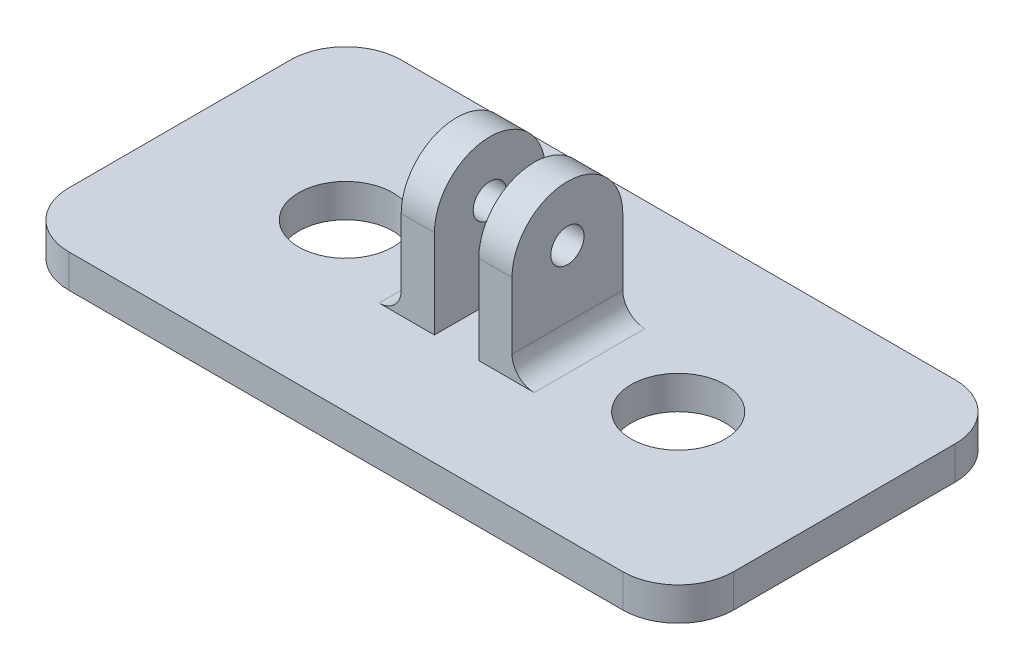
ISO-10303-21;
HEADER;
FILE_DESCRIPTION(('STEP AP214'),'2;1');
FILE_NAME('part.step','',(''),(''),'','','');
FILE_SCHEMA(('AUTOMOTIVE_DESIGN { 1 0 10303 214 1 1 1 1 }'));
ENDSEC;
DATA;
#1=APPLICATION_CONTEXT('core data for automotive mechanical design processes');
#2=APPLICATION_PROTOCOL_DEFINITION('international standard','automotive_design',2000,#1);
#3=PRODUCT_CONTEXT('',#1,'mechanical');
#4=PRODUCT('Part','Part','',(#3));
#5=PRODUCT_RELATED_PRODUCT_CATEGORY('part','',(#4));
#6=PRODUCT_DEFINITION_FORMATION('','',#4);
#7=PRODUCT_DEFINITION_CONTEXT('part definition',#1,'design');
#8=PRODUCT_DEFINITION('design','',#6,#7);
#9=PRODUCT_DEFINITION_SHAPE('','',#8);
#10=(LENGTH_UNIT() NAMED_UNIT(*) SI_UNIT(.MILLI.,.METRE.));
#11=(NAMED_UNIT(*) PLANE_ANGLE_UNIT() SI_UNIT($,.RADIAN.));
#12=(NAMED_UNIT(*) SI_UNIT($,.STERADIAN.) SOLID_ANGLE_UNIT());
#13=UNCERTAINTY_MEASURE_WITH_UNIT(LENGTH_MEASURE(1.E-05),#10,'distance_accuracy_value','');
#14=(GEOMETRIC_REPRESENTATION_CONTEXT(3) GLOBAL_UNCERTAINTY_ASSIGNED_CONTEXT((#13)) GLOBAL_UNIT_ASSIGNED_CONTEXT((#10,
#11,#12)) REPRESENTATION_CONTEXT('',''));
#15=CARTESIAN_POINT('',(0.,0.,0.));
#16=DIRECTION('',(0.,0.,1.));
#17=DIRECTION('',(1.,0.,0.));
#18=AXIS2_PLACEMENT_3D('',#15,#16,#17);
#19=CARTESIAN_POINT('',(-5.,16.,-5.));
#20=DIRECTION('',(1.,0.,0.));
#21=DIRECTION('',(0.,0.,-1.));
#22=AXIS2_PLACEMENT_3D('',#19,#20,#21);
#23=PLANE('',#22);
#24=CARTESIAN_POINT('',(-5.,11.,0.));
#25=DIRECTION('',(-1.,0.,0.));
#26=DIRECTION('',(0.,0.,1.));
#27=AXIS2_PLACEMENT_3D('',#24,#25,#26);
#28=CIRCLE('',#27,1.5);
#29=CARTESIAN_POINT('',(-5.,11.,1.5));
#30=VERTEX_POINT('',#29);
#31=EDGE_CURVE('E216',#30,#30,#28,.T.);
#32=ORIENTED_EDGE('',*,*,#31,.F.);
#33=EDGE_LOOP('',(#32));
#34=FACE_BOUND('',#33,.T.);
#35=DIRECTION('',(0.,0.,1.));
#36=VECTOR('',#35,1.);
#37=CARTESIAN_POINT('',(-5.,5.,-5.));
#38=LINE('',#37,#36);
#39=CARTESIAN_POINT('',(-5.,5.,-5.));
#40=VERTEX_POINT('',#39);
#41=CARTESIAN_POINT('',(-5.,5.,5.));
#42=VERTEX_POINT('',#41);
#43=EDGE_CURVE('E56',#40,#42,#38,.T.);
#44=ORIENTED_EDGE('',*,*,#43,.T.);
#45=DIRECTION('',(0.,-1.,0.));
#46=VECTOR('',#45,1.);
#47=CARTESIAN_POINT('',(-5.,16.,5.));
#48=LINE('',#47,#46);
#49=CARTESIAN_POINT('',(-5.,11.,5.));
#50=VERTEX_POINT('',#49);
#51=EDGE_CURVE('E280',#50,#42,#48,.T.);
#52=ORIENTED_EDGE('',*,*,#51,.F.);
#53=CARTESIAN_POINT('',(-5.,11.,0.));
#54=DIRECTION('',(1.,0.,0.));
#55=DIRECTION('',(0.,0.,-1.));
#56=AXIS2_PLACEMENT_3D('',#53,#54,#55);
#57=CIRCLE('',#56,5.);
#58=CARTESIAN_POINT('',(-5.,11.,-5.));
#59=VERTEX_POINT('',#58);
#60=EDGE_CURVE('E245',#59,#50,#57,.T.);
#61=ORIENTED_EDGE('',*,*,#60,.F.);
#62=DIRECTION('',(0.,-1.,0.));
#63=VECTOR('',#62,1.);
#64=CARTESIAN_POINT('',(-5.,16.,-5.));
#65=LINE('',#64,#63);
#66=EDGE_CURVE('E283',#59,#40,#65,.T.);
#67=ORIENTED_EDGE('',*,*,#66,.T.);
#68=EDGE_LOOP('',(#44,#52,#61,#67));
#69=FACE_BOUND('',#68,.T.);
#70=ADVANCED_FACE('F39',(#34,#69),#23,.F.);
#71=CARTESIAN_POINT('',(-2.,16.,-5.));
#72=DIRECTION('',(-1.,0.,0.));
#73=DIRECTION('',(0.,0.,1.));
#74=AXIS2_PLACEMENT_3D('',#71,#72,#73);
#75=PLANE('',#74);
#76=CARTESIAN_POINT('',(-2.,11.,0.));
#77=DIRECTION('',(-1.,0.,0.));
#78=DIRECTION('',(0.,0.,1.));
#79=AXIS2_PLACEMENT_3D('',#76,#77,#78);
#80=CIRCLE('',#79,1.5);
#81=CARTESIAN_POINT('',(-2.,11.,1.5));
#82=VERTEX_POINT('',#81);
#83=EDGE_CURVE('E226',#82,#82,#80,.T.);
#84=ORIENTED_EDGE('',*,*,#83,.T.);
#85=EDGE_LOOP('',(#84));
#86=FACE_BOUND('',#85,.T.);
#87=DIRECTION('',(0.,-1.,0.));
#88=VECTOR('',#87,1.);
#89=CARTESIAN_POINT('',(-2.,16.,-5.));
#90=LINE('',#89,#88);
#91=CARTESIAN_POINT('',(-2.,11.,-5.));
#92=VERTEX_POINT('',#91);
#93=CARTESIAN_POINT('',(-2.,3.,-5.));
#94=VERTEX_POINT('',#93);
#95=EDGE_CURVE('E286',#92,#94,#90,.T.);
#96=ORIENTED_EDGE('',*,*,#95,.F.);
#97=CARTESIAN_POINT('',(-2.,11.,0.));
#98=DIRECTION('',(-1.,0.,0.));
#99=DIRECTION('',(0.,0.,1.));
#100=AXIS2_PLACEMENT_3D('',#97,#98,#99);
#101=CIRCLE('',#100,5.);
#102=CARTESIAN_POINT('',(-2.,11.,5.));
#103=VERTEX_POINT('',#102);
#104=EDGE_CURVE('E181',#103,#92,#101,.T.);
#105=ORIENTED_EDGE('',*,*,#104,.F.);
#106=DIRECTION('',(0.,-1.,0.));
#107=VECTOR('',#106,1.);
#108=CARTESIAN_POINT('',(-2.,16.,5.));
#109=LINE('',#108,#107);
#110=CARTESIAN_POINT('',(-2.,3.,5.));
#111=VERTEX_POINT('',#110);
#112=EDGE_CURVE('E277',#103,#111,#109,.T.);
#113=ORIENTED_EDGE('',*,*,#112,.T.);
#114=DIRECTION('',(0.,0.,-1.));
#115=VECTOR('',#114,1.);
#116=CARTESIAN_POINT('',(-2.,3.,-5.));
#117=LINE('',#116,#115);
#118=EDGE_CURVE('E267',#111,#94,#117,.T.);
#119=ORIENTED_EDGE('',*,*,#118,.T.);
#120=EDGE_LOOP('',(#96,#105,#113,#119));
#121=FACE_BOUND('',#120,.T.);
#122=ADVANCED_FACE('F433',(#86,#121),#75,.F.);
#123=CARTESIAN_POINT('',(5.,16.,-5.));
#124=DIRECTION('',(-1.,0.,0.));
#125=DIRECTION('',(0.,0.,1.));
#126=AXIS2_PLACEMENT_3D('',#123,#124,#125);
#127=PLANE('',#126);
#128=CARTESIAN_POINT('',(5.,11.,0.));
#129=DIRECTION('',(-1.,0.,0.));
#130=DIRECTION('',(0.,0.,1.));
#131=AXIS2_PLACEMENT_3D('',#128,#129,#130);
#132=CIRCLE('',#131,1.5);
#133=CARTESIAN_POINT('',(5.,11.,1.5));
#134=VERTEX_POINT('',#133);
#135=EDGE_CURVE('E222',#134,#134,#132,.T.);
#136=ORIENTED_EDGE('',*,*,#135,.T.);
#137=EDGE_LOOP('',(#136));
#138=FACE_BOUND('',#137,.T.);
#139=DIRECTION('',(0.,-1.,0.));
#140=VECTOR('',#139,1.);
#141=CARTESIAN_POINT('',(5.,16.,5.));
#142=LINE('',#141,#140);
#143=CARTESIAN_POINT('',(5.,11.,5.));
#144=VERTEX_POINT('',#143);
#145=CARTESIAN_POINT('',(5.,5.,5.));
#146=VERTEX_POINT('',#145);
#147=EDGE_CURVE('E255',#144,#146,#142,.T.);
#148=ORIENTED_EDGE('',*,*,#147,.T.);
#149=DIRECTION('',(0.,0.,1.));
#150=VECTOR('',#149,1.);
#151=CARTESIAN_POINT('',(5.,5.,-5.));
#152=LINE('',#151,#150);
#153=CARTESIAN_POINT('',(5.,5.,-5.));
#154=VERTEX_POINT('',#153);
#155=EDGE_CURVE('E191',#154,#146,#152,.T.);
#156=ORIENTED_EDGE('',*,*,#155,.F.);
#157=DIRECTION('',(0.,-1.,0.));
#158=VECTOR('',#157,1.);
#159=CARTESIAN_POINT('',(5.,16.,-5.));
#160=LINE('',#159,#158);
#161=CARTESIAN_POINT('',(5.,11.,-5.));
#162=VERTEX_POINT('',#161);
#163=EDGE_CURVE('E196',#162,#154,#160,.T.);
#164=ORIENTED_EDGE('',*,*,#163,.F.);
#165=CARTESIAN_POINT('',(5.,11.,0.));
#166=DIRECTION('',(1.,0.,0.));
#167=DIRECTION('',(0.,0.,-1.));
#168=AXIS2_PLACEMENT_3D('',#165,#166,#167);
#169=CIRCLE('',#168,5.);
#170=EDGE_CURVE('E234',#162,#144,#169,.T.);
#171=ORIENTED_EDGE('',*,*,#170,.T.);
#172=EDGE_LOOP('',(#148,#156,#164,#171));
#173=FACE_BOUND('',#172,.T.);
#174=ADVANCED_FACE('F439',(#138,#173),#127,.F.);
#175=CARTESIAN_POINT('',(2.,16.,-5.));
#176=DIRECTION('',(1.,0.,0.));
#177=DIRECTION('',(0.,0.,-1.));
#178=AXIS2_PLACEMENT_3D('',#175,#176,#177);
#179=PLANE('',#178);
#180=CARTESIAN_POINT('',(2.,11.,0.));
#181=DIRECTION('',(1.,0.,0.));
#182=DIRECTION('',(0.,0.,-1.));
#183=AXIS2_PLACEMENT_3D('',#180,#181,#182);
#184=CIRCLE('',#183,1.5);
#185=CARTESIAN_POINT('',(2.,11.,1.5));
#186=VERTEX_POINT('',#185);
#187=EDGE_CURVE('E43',#186,#186,#184,.T.);
#188=ORIENTED_EDGE('',*,*,#187,.T.);
#189=EDGE_LOOP('',(#188));
#190=FACE_BOUND('',#189,.T.);
#191=CARTESIAN_POINT('',(2.,11.,0.));
#192=DIRECTION('',(1.,0.,0.));
#193=DIRECTION('',(0.,0.,-1.));
#194=AXIS2_PLACEMENT_3D('',#191,#192,#193);
#195=CIRCLE('',#194,5.);
#196=CARTESIAN_POINT('',(1.99999999999999,11.,-5.));
#197=VERTEX_POINT('',#196);
#198=CARTESIAN_POINT('',(1.99999999999999,11.,5.));
#199=VERTEX_POINT('',#198);
#200=EDGE_CURVE('E242',#197,#199,#195,.T.);
#201=ORIENTED_EDGE('',*,*,#200,.F.);
#202=DIRECTION('',(0.,-1.,0.));
#203=VECTOR('',#202,1.);
#204=CARTESIAN_POINT('',(2.,16.,-5.));
#205=LINE('',#204,#203);
#206=CARTESIAN_POINT('',(2.,3.,-5.));
#207=VERTEX_POINT('',#206);
#208=EDGE_CURVE('E262',#197,#207,#205,.T.);
#209=ORIENTED_EDGE('',*,*,#208,.T.);
#210=DIRECTION('',(0.,0.,1.));
#211=VECTOR('',#210,1.);
#212=CARTESIAN_POINT('',(2.,3.,-5.));
#213=LINE('',#212,#211);
#214=CARTESIAN_POINT('',(2.,3.,5.));
#215=VERTEX_POINT('',#214);
#216=EDGE_CURVE('E176',#207,#215,#213,.T.);
#217=ORIENTED_EDGE('',*,*,#216,.T.);
#218=DIRECTION('',(0.,-1.,0.));
#219=VECTOR('',#218,1.);
#220=CARTESIAN_POINT('',(2.,16.,5.));
#221=LINE('',#220,#219);
#222=EDGE_CURVE('E259',#199,#215,#221,.T.);
#223=ORIENTED_EDGE('',*,*,#222,.F.);
#224=EDGE_LOOP('',(#201,#209,#217,#223));
#225=FACE_BOUND('',#224,.T.);
#226=ADVANCED_FACE('F523',(#190,#225),#179,.F.);
#227=CARTESIAN_POINT('',(-5.,16.,5.));
#228=DIRECTION('',(0.,0.,-1.));
#229=DIRECTION('',(-1.,0.,0.));
#230=AXIS2_PLACEMENT_3D('',#227,#228,#229);
#231=PLANE('',#230);
#232=DIRECTION('',(1.,0.,0.));
#233=VECTOR('',#232,1.);
#234=CARTESIAN_POINT('',(-8.,11.,5.));
#235=LINE('',#234,#233);
#236=EDGE_CURVE('E241',#50,#103,#235,.T.);
#237=ORIENTED_EDGE('',*,*,#236,.F.);
#238=ORIENTED_EDGE('',*,*,#51,.T.);
#239=CARTESIAN_POINT('',(-7.,5.,5.));
#240=DIRECTION('',(0.,0.,-1.));
#241=DIRECTION('',(-1.,0.,0.));
#242=AXIS2_PLACEMENT_3D('',#239,#240,#241);
#243=CIRCLE('',#242,2.);
#244=CARTESIAN_POINT('',(-7.,3.,5.));
#245=VERTEX_POINT('',#244);
#246=EDGE_CURVE('E203',#42,#245,#243,.T.);
#247=ORIENTED_EDGE('',*,*,#246,.T.);
#248=DIRECTION('',(1.,0.,0.));
#249=VECTOR('',#248,1.);
#250=CARTESIAN_POINT('',(-5.,3.,5.));
#251=LINE('',#250,#249);
#252=EDGE_CURVE('E273',#245,#111,#251,.T.);
#253=ORIENTED_EDGE('',*,*,#252,.T.);
#254=ORIENTED_EDGE('',*,*,#112,.F.);
#255=EDGE_LOOP('',(#237,#238,#247,#253,#254));
#256=FACE_BOUND('',#255,.T.);
#257=ADVANCED_FACE('F444',(#256),#231,.F.);
#258=CARTESIAN_POINT('',(2.,16.,5.));
#259=DIRECTION('',(0.,0.,-1.));
#260=DIRECTION('',(-1.,0.,0.));
#261=AXIS2_PLACEMENT_3D('',#258,#259,#260);
#262=PLANE('',#261);
#263=EDGE_CURVE('E238',#199,#144,#235,.T.);
#264=ORIENTED_EDGE('',*,*,#263,.F.);
#265=ORIENTED_EDGE('',*,*,#222,.T.);
#266=DIRECTION('',(1.,0.,0.));
#267=VECTOR('',#266,1.);
#268=CARTESIAN_POINT('',(2.,3.,5.));
#269=LINE('',#268,#267);
#270=CARTESIAN_POINT('',(7.,3.,5.));
#271=VERTEX_POINT('',#270);
#272=EDGE_CURVE('E252',#215,#271,#269,.T.);
#273=ORIENTED_EDGE('',*,*,#272,.T.);
#274=CARTESIAN_POINT('',(7.,5.,5.));
#275=DIRECTION('',(0.,0.,-1.));
#276=DIRECTION('',(-1.,0.,0.));
#277=AXIS2_PLACEMENT_3D('',#274,#275,#276);
#278=CIRCLE('',#277,2.);
#279=EDGE_CURVE('E189',#271,#146,#278,.T.);
#280=ORIENTED_EDGE('',*,*,#279,.T.);
#281=ORIENTED_EDGE('',*,*,#147,.F.);
#282=EDGE_LOOP('',(#264,#265,#273,#280,#281));
#283=FACE_BOUND('',#282,.T.);
#284=ADVANCED_FACE('F457',(#283),#262,.F.);
#285=CARTESIAN_POINT('',(0.,3.,0.));
#286=DIRECTION('',(0.,1.,0.));
#287=DIRECTION('',(0.,0.,1.));
#288=AXIS2_PLACEMENT_3D('',#285,#286,#287);
#289=PLANE('',#288);
#290=DIRECTION('',(-1.,0.,0.));
#291=VECTOR('',#290,1.);
#292=CARTESIAN_POINT('',(2.,3.,-5.));
#293=LINE('',#292,#291);
#294=CARTESIAN_POINT('',(7.,3.,-5.));
#295=VERTEX_POINT('',#294);
#296=EDGE_CURVE('E169',#295,#207,#293,.T.);
#297=ORIENTED_EDGE('',*,*,#296,.F.);
#298=DIRECTION('',(0.,0.,1.));
#299=VECTOR('',#298,1.);
#300=CARTESIAN_POINT('',(7.,3.,-5.));
#301=LINE('',#300,#299);
#302=EDGE_CURVE('E174',#295,#271,#301,.T.);
#303=ORIENTED_EDGE('',*,*,#302,.T.);
#304=ORIENTED_EDGE('',*,*,#272,.F.);
#305=ORIENTED_EDGE('',*,*,#216,.F.);
#306=EDGE_LOOP('',(#297,#303,#304,#305));
#307=FACE_BOUND('',#306,.T.);
#308=DIRECTION('',(0.,0.,1.));
#309=VECTOR('',#308,1.);
#310=CARTESIAN_POINT('',(-7.00000000000001,3.,-5.));
#311=LINE('',#310,#309);
#312=CARTESIAN_POINT('',(-7.,3.,-5.));
#313=VERTEX_POINT('',#312);
#314=EDGE_CURVE('E212',#313,#245,#311,.T.);
#315=ORIENTED_EDGE('',*,*,#314,.F.);
#316=DIRECTION('',(-1.,0.,0.));
#317=VECTOR('',#316,1.);
#318=CARTESIAN_POINT('',(-5.,3.,-5.));
#319=LINE('',#318,#317);
#320=EDGE_CURVE('E64',#94,#313,#319,.T.);
#321=ORIENTED_EDGE('',*,*,#320,.F.);
#322=ORIENTED_EDGE('',*,*,#118,.F.);
#323=ORIENTED_EDGE('',*,*,#252,.F.);
#324=EDGE_LOOP('',(#315,#321,#322,#323));
#325=FACE_BOUND('',#324,.T.);
#326=CARTESIAN_POINT('',(-15.,3.,0.));
#327=DIRECTION('',(0.,1.,0.));
#328=DIRECTION('',(0.,0.,1.));
#329=AXIS2_PLACEMENT_3D('',#326,#327,#328);
#330=CIRCLE('',#329,4.25);
#331=CARTESIAN_POINT('',(-15.,3.,4.25));
#332=VERTEX_POINT('',#331);
#333=EDGE_CURVE('E295',#332,#332,#330,.T.);
#334=ORIENTED_EDGE('',*,*,#333,.F.);
#335=EDGE_LOOP('',(#334));
#336=FACE_BOUND('',#335,.T.);
#337=CARTESIAN_POINT('',(15.,3.,0.));
#338=DIRECTION('',(0.,1.,0.));
#339=DIRECTION('',(0.,0.,1.));
#340=AXIS2_PLACEMENT_3D('',#337,#338,#339);
#341=CIRCLE('',#340,4.25);
#342=CARTESIAN_POINT('',(15.,3.,4.25));
#343=VERTEX_POINT('',#342);
#344=EDGE_CURVE('E289',#343,#343,#341,.T.);
#345=ORIENTED_EDGE('',*,*,#344,.F.);
#346=EDGE_LOOP('',(#345));
#347=FACE_BOUND('',#346,.T.);
#348=DIRECTION('',(-1.,0.,0.));
#349=VECTOR('',#348,1.);
#350=CARTESIAN_POINT('',(-30.,3.,-15.));
#351=LINE('',#350,#349);
#352=CARTESIAN_POINT('',(25.,3.,-15.));
#353=VERTEX_POINT('',#352);
#354=CARTESIAN_POINT('',(-25.,3.,-15.));
#355=VERTEX_POINT('',#354);
#356=EDGE_CURVE('E310',#353,#355,#351,.T.);
#357=ORIENTED_EDGE('',*,*,#356,.T.);
#358=CARTESIAN_POINT('',(-25.,3.,-10.));
#359=DIRECTION('',(0.,1.,0.));
#360=DIRECTION('',(0.,0.,1.));
#361=AXIS2_PLACEMENT_3D('',#358,#359,#360);
#362=CIRCLE('',#361,5.);
#363=CARTESIAN_POINT('',(-30.,3.,-10.));
#364=VERTEX_POINT('',#363);
#365=EDGE_CURVE('E372',#355,#364,#362,.T.);
#366=ORIENTED_EDGE('',*,*,#365,.T.);
#367=DIRECTION('',(0.,0.,1.));
#368=VECTOR('',#367,1.);
#369=CARTESIAN_POINT('',(-30.,3.,-15.));
#370=LINE('',#369,#368);
#371=CARTESIAN_POINT('',(-30.,3.,10.));
#372=VERTEX_POINT('',#371);
#373=EDGE_CURVE('E315',#364,#372,#370,.T.);
#374=ORIENTED_EDGE('',*,*,#373,.T.);
#375=CARTESIAN_POINT('',(-25.,3.,10.));
#376=DIRECTION('',(0.,1.,0.));
#377=DIRECTION('',(0.,0.,1.));
#378=AXIS2_PLACEMENT_3D('',#375,#376,#377);
#379=CIRCLE('',#378,5.);
#380=CARTESIAN_POINT('',(-25.,3.,15.));
#381=VERTEX_POINT('',#380);
#382=EDGE_CURVE('E363',#372,#381,#379,.T.);
#383=ORIENTED_EDGE('',*,*,#382,.T.);
#384=DIRECTION('',(1.,0.,0.));
#385=VECTOR('',#384,1.);
#386=CARTESIAN_POINT('',(-30.,3.,15.));
#387=LINE('',#386,#385);
#388=CARTESIAN_POINT('',(25.,3.,15.));
#389=VERTEX_POINT('',#388);
#390=EDGE_CURVE('E319',#381,#389,#387,.T.);
#391=ORIENTED_EDGE('',*,*,#390,.T.);
#392=CARTESIAN_POINT('',(25.,3.,10.));
#393=DIRECTION('',(0.,1.,0.));
#394=DIRECTION('',(0.,0.,1.));
#395=AXIS2_PLACEMENT_3D('',#392,#393,#394);
#396=CIRCLE('',#395,5.);
#397=CARTESIAN_POINT('',(30.,3.,10.));
#398=VERTEX_POINT('',#397);
#399=EDGE_CURVE('E366',#389,#398,#396,.T.);
#400=ORIENTED_EDGE('',*,*,#399,.T.);
#401=DIRECTION('',(0.,0.,-1.));
#402=VECTOR('',#401,1.);
#403=CARTESIAN_POINT('',(30.,3.,-15.));
#404=LINE('',#403,#402);
#405=CARTESIAN_POINT('',(30.,3.,-10.));
#406=VERTEX_POINT('',#405);
#407=EDGE_CURVE('E306',#398,#406,#404,.T.);
#408=ORIENTED_EDGE('',*,*,#407,.T.);
#409=CARTESIAN_POINT('',(25.,3.,-10.));
#410=DIRECTION('',(0.,1.,0.));
#411=DIRECTION('',(0.,0.,1.));
#412=AXIS2_PLACEMENT_3D('',#409,#410,#411);
#413=CIRCLE('',#412,5.);
#414=EDGE_CURVE('E369',#406,#353,#413,.T.);
#415=ORIENTED_EDGE('',*,*,#414,.T.);
#416=EDGE_LOOP('',(#357,#366,#374,#383,#391,#400,#408,#415));
#417=FACE_BOUND('',#416,.T.);
#418=ADVANCED_FACE('F171',(#307,#325,#336,#347,#417),#289,.T.);
#419=CARTESIAN_POINT('',(30.,3.,-15.));
#420=DIRECTION('',(-1.,0.,0.));
#421=DIRECTION('',(0.,0.,1.));
#422=AXIS2_PLACEMENT_3D('',#419,#420,#421);
#423=PLANE('',#422);
#424=DIRECTION('',(0.,0.,-1.));
#425=VECTOR('',#424,1.);
#426=CARTESIAN_POINT('',(30.,0.,-15.));
#427=LINE('',#426,#425);
#428=CARTESIAN_POINT('',(30.,0.,10.));
#429=VERTEX_POINT('',#428);
#430=CARTESIAN_POINT('',(30.,0.,-10.));
#431=VERTEX_POINT('',#430);
#432=EDGE_CURVE('E294',#429,#431,#427,.T.);
#433=ORIENTED_EDGE('',*,*,#432,.T.);
#434=DIRECTION('',(0.,-1.,0.));
#435=VECTOR('',#434,1.);
#436=CARTESIAN_POINT('',(30.,3.,-10.));
#437=LINE('',#436,#435);
#438=EDGE_CURVE('E379',#431,#406,#437,.F.);
#439=ORIENTED_EDGE('',*,*,#438,.T.);
#440=ORIENTED_EDGE('',*,*,#407,.F.);
#441=DIRECTION('',(0.,-1.,0.));
#442=VECTOR('',#441,1.);
#443=CARTESIAN_POINT('',(30.,3.,10.));
#444=LINE('',#443,#442);
#445=EDGE_CURVE('E375',#398,#429,#444,.T.);
#446=ORIENTED_EDGE('',*,*,#445,.T.);
#447=EDGE_LOOP('',(#433,#439,#440,#446));
#448=FACE_BOUND('',#447,.T.);
#449=ADVANCED_FACE('F402',(#448),#423,.F.);
#450=CARTESIAN_POINT('',(-30.,3.,-15.));
#451=DIRECTION('',(0.,0.,1.));
#452=DIRECTION('',(1.,0.,0.));
#453=AXIS2_PLACEMENT_3D('',#450,#451,#452);
#454=PLANE('',#453);
#455=DIRECTION('',(-1.,0.,0.));
#456=VECTOR('',#455,1.);
#457=CARTESIAN_POINT('',(-30.,0.,-15.));
#458=LINE('',#457,#456);
#459=CARTESIAN_POINT('',(25.,0.,-15.));
#460=VERTEX_POINT('',#459);
#461=CARTESIAN_POINT('',(-25.,0.,-15.));
#462=VERTEX_POINT('',#461);
#463=EDGE_CURVE('E327',#460,#462,#458,.T.);
#464=ORIENTED_EDGE('',*,*,#463,.T.);
#465=DIRECTION('',(0.,-1.,0.));
#466=VECTOR('',#465,1.);
#467=CARTESIAN_POINT('',(-25.,3.,-15.));
#468=LINE('',#467,#466);
#469=EDGE_CURVE('E360',#462,#355,#468,.F.);
#470=ORIENTED_EDGE('',*,*,#469,.T.);
#471=ORIENTED_EDGE('',*,*,#356,.F.);
#472=DIRECTION('',(0.,-1.,0.));
#473=VECTOR('',#472,1.);
#474=CARTESIAN_POINT('',(25.,3.,-15.));
#475=LINE('',#474,#473);
#476=EDGE_CURVE('E356',#353,#460,#475,.T.);
#477=ORIENTED_EDGE('',*,*,#476,.T.);
#478=EDGE_LOOP('',(#464,#470,#471,#477));
#479=FACE_BOUND('',#478,.T.);
#480=ADVANCED_FACE('F414',(#479),#454,.F.);
#481=CARTESIAN_POINT('',(-30.,3.,-15.));
#482=DIRECTION('',(1.,0.,0.));
#483=DIRECTION('',(0.,0.,-1.));
#484=AXIS2_PLACEMENT_3D('',#481,#482,#483);
#485=PLANE('',#484);
#486=ORIENTED_EDGE('',*,*,#373,.F.);
#487=DIRECTION('',(0.,-1.,0.));
#488=VECTOR('',#487,1.);
#489=CARTESIAN_POINT('',(-30.,3.,-10.));
#490=LINE('',#489,#488);
#491=CARTESIAN_POINT('',(-30.,0.,-10.));
#492=VERTEX_POINT('',#491);
#493=EDGE_CURVE('E340',#364,#492,#490,.T.);
#494=ORIENTED_EDGE('',*,*,#493,.T.);
#495=DIRECTION('',(0.,0.,1.));
#496=VECTOR('',#495,1.);
#497=CARTESIAN_POINT('',(-30.,0.,-15.));
#498=LINE('',#497,#496);
#499=CARTESIAN_POINT('',(-30.,0.,10.));
#500=VERTEX_POINT('',#499);
#501=EDGE_CURVE('E331',#492,#500,#498,.T.);
#502=ORIENTED_EDGE('',*,*,#501,.T.);
#503=DIRECTION('',(0.,-1.,0.));
#504=VECTOR('',#503,1.);
#505=CARTESIAN_POINT('',(-30.,3.,10.));
#506=LINE('',#505,#504);
#507=EDGE_CURVE('E323',#500,#372,#506,.F.);
#508=ORIENTED_EDGE('',*,*,#507,.T.);
#509=EDGE_LOOP('',(#486,#494,#502,#508));
#510=FACE_BOUND('',#509,.T.);
#511=ADVANCED_FACE('F422',(#510),#485,.F.);
#512=CARTESIAN_POINT('',(-30.,3.,15.));
#513=DIRECTION('',(0.,0.,-1.));
#514=DIRECTION('',(-1.,0.,0.));
#515=AXIS2_PLACEMENT_3D('',#512,#513,#514);
#516=PLANE('',#515);
#517=DIRECTION('',(1.,0.,0.));
#518=VECTOR('',#517,1.);
#519=CARTESIAN_POINT('',(-30.,0.,15.));
#520=LINE('',#519,#518);
#521=CARTESIAN_POINT('',(-25.,0.,15.));
#522=VERTEX_POINT('',#521);
#523=CARTESIAN_POINT('',(25.,0.,15.));
#524=VERTEX_POINT('',#523);
#525=EDGE_CURVE('E311',#522,#524,#520,.T.);
#526=ORIENTED_EDGE('',*,*,#525,.T.);
#527=DIRECTION('',(0.,-1.,0.));
#528=VECTOR('',#527,1.);
#529=CARTESIAN_POINT('',(25.,3.,15.));
#530=LINE('',#529,#528);
#531=EDGE_CURVE('E49',#524,#389,#530,.F.);
#532=ORIENTED_EDGE('',*,*,#531,.T.);
#533=ORIENTED_EDGE('',*,*,#390,.F.);
#534=DIRECTION('',(0.,-1.,0.));
#535=VECTOR('',#534,1.);
#536=CARTESIAN_POINT('',(-25.,3.,15.));
#537=LINE('',#536,#535);
#538=EDGE_CURVE('E382',#381,#522,#537,.T.);
#539=ORIENTED_EDGE('',*,*,#538,.T.);
#540=EDGE_LOOP('',(#526,#532,#533,#539));
#541=FACE_BOUND('',#540,.T.);
#542=ADVANCED_FACE('F390',(#541),#516,.F.);
#543=CARTESIAN_POINT('',(0.,0.,0.));
#544=DIRECTION('',(0.,1.,0.));
#545=DIRECTION('',(0.,0.,1.));
#546=AXIS2_PLACEMENT_3D('',#543,#544,#545);
#547=PLANE('',#546);
#548=CARTESIAN_POINT('',(-15.,0.,0.));
#549=DIRECTION('',(0.,1.,0.));
#550=DIRECTION('',(0.,0.,1.));
#551=AXIS2_PLACEMENT_3D('',#548,#549,#550);
#552=CIRCLE('',#551,4.25);
#553=CARTESIAN_POINT('',(-15.,0.,4.25));
#554=VERTEX_POINT('',#553);
#555=EDGE_CURVE('E290',#554,#554,#552,.T.);
#556=ORIENTED_EDGE('',*,*,#555,.T.);
#557=EDGE_LOOP('',(#556));
#558=FACE_BOUND('',#557,.T.);
#559=CARTESIAN_POINT('',(15.,0.,0.));
#560=DIRECTION('',(0.,1.,0.));
#561=DIRECTION('',(0.,0.,1.));
#562=AXIS2_PLACEMENT_3D('',#559,#560,#561);
#563=CIRCLE('',#562,4.25);
#564=CARTESIAN_POINT('',(15.,0.,4.25));
#565=VERTEX_POINT('',#564);
#566=EDGE_CURVE('E299',#565,#565,#563,.T.);
#567=ORIENTED_EDGE('',*,*,#566,.T.);
#568=EDGE_LOOP('',(#567));
#569=FACE_BOUND('',#568,.T.);
#570=ORIENTED_EDGE('',*,*,#501,.F.);
#571=CARTESIAN_POINT('',(-25.,0.,-10.));
#572=DIRECTION('',(0.,1.,0.));
#573=DIRECTION('',(0.,0.,1.));
#574=AXIS2_PLACEMENT_3D('',#571,#572,#573);
#575=CIRCLE('',#574,5.);
#576=EDGE_CURVE('E353',#492,#462,#575,.F.);
#577=ORIENTED_EDGE('',*,*,#576,.T.);
#578=ORIENTED_EDGE('',*,*,#463,.F.);
#579=CARTESIAN_POINT('',(25.,0.,-10.));
#580=DIRECTION('',(0.,1.,0.));
#581=DIRECTION('',(0.,0.,1.));
#582=AXIS2_PLACEMENT_3D('',#579,#580,#581);
#583=CIRCLE('',#582,5.);
#584=EDGE_CURVE('E350',#460,#431,#583,.F.);
#585=ORIENTED_EDGE('',*,*,#584,.T.);
#586=ORIENTED_EDGE('',*,*,#432,.F.);
#587=CARTESIAN_POINT('',(25.,0.,10.));
#588=DIRECTION('',(0.,1.,0.));
#589=DIRECTION('',(0.,0.,1.));
#590=AXIS2_PLACEMENT_3D('',#587,#588,#589);
#591=CIRCLE('',#590,5.);
#592=EDGE_CURVE('E347',#429,#524,#591,.F.);
#593=ORIENTED_EDGE('',*,*,#592,.T.);
#594=ORIENTED_EDGE('',*,*,#525,.F.);
#595=CARTESIAN_POINT('',(-25.,0.,10.));
#596=DIRECTION('',(0.,1.,0.));
#597=DIRECTION('',(0.,0.,1.));
#598=AXIS2_PLACEMENT_3D('',#595,#596,#597);
#599=CIRCLE('',#598,5.);
#600=EDGE_CURVE('E344',#522,#500,#599,.F.);
#601=ORIENTED_EDGE('',*,*,#600,.T.);
#602=EDGE_LOOP('',(#570,#577,#578,#585,#586,#593,#594,#601));
#603=FACE_BOUND('',#602,.T.);
#604=ADVANCED_FACE('F406',(#558,#569,#603),#547,.F.);
#605=CARTESIAN_POINT('',(15.,0.,0.));
#606=DIRECTION('',(0.,1.,0.));
#607=DIRECTION('',(0.,0.,1.));
#608=AXIS2_PLACEMENT_3D('',#605,#606,#607);
#609=CYLINDRICAL_SURFACE('',#608,4.25);
#610=ORIENTED_EDGE('',*,*,#566,.F.);
#611=EDGE_LOOP('',(#610));
#612=FACE_BOUND('',#611,.T.);
#613=ORIENTED_EDGE('',*,*,#344,.T.);
#614=EDGE_LOOP('',(#613));
#615=FACE_BOUND('',#614,.T.);
#616=ADVANCED_FACE('F450',(#612,#615),#609,.F.);
#617=CARTESIAN_POINT('',(-15.,0.,0.));
#618=DIRECTION('',(0.,1.,0.));
#619=DIRECTION('',(0.,0.,1.));
#620=AXIS2_PLACEMENT_3D('',#617,#618,#619);
#621=CYLINDRICAL_SURFACE('',#620,4.25);
#622=ORIENTED_EDGE('',*,*,#555,.F.);
#623=EDGE_LOOP('',(#622));
#624=FACE_BOUND('',#623,.T.);
#625=ORIENTED_EDGE('',*,*,#333,.T.);
#626=EDGE_LOOP('',(#625));
#627=FACE_BOUND('',#626,.T.);
#628=ADVANCED_FACE('F447',(#624,#627),#621,.F.);
#629=CARTESIAN_POINT('',(-25.,3.,-10.));
#630=DIRECTION('',(0.,-1.,0.));
#631=DIRECTION('',(0.,0.,-1.));
#632=AXIS2_PLACEMENT_3D('',#629,#630,#631);
#633=CYLINDRICAL_SURFACE('',#632,5.);
#634=ORIENTED_EDGE('',*,*,#365,.F.);
#635=ORIENTED_EDGE('',*,*,#469,.F.);
#636=ORIENTED_EDGE('',*,*,#576,.F.);
#637=ORIENTED_EDGE('',*,*,#493,.F.);
#638=EDGE_LOOP('',(#634,#635,#636,#637));
#639=FACE_BOUND('',#638,.T.);
#640=ADVANCED_FACE('F420',(#639),#633,.T.);
#641=CARTESIAN_POINT('',(25.,3.,-10.));
#642=DIRECTION('',(0.,-1.,0.));
#643=DIRECTION('',(0.,0.,-1.));
#644=AXIS2_PLACEMENT_3D('',#641,#642,#643);
#645=CYLINDRICAL_SURFACE('',#644,5.);
#646=ORIENTED_EDGE('',*,*,#414,.F.);
#647=ORIENTED_EDGE('',*,*,#438,.F.);
#648=ORIENTED_EDGE('',*,*,#584,.F.);
#649=ORIENTED_EDGE('',*,*,#476,.F.);
#650=EDGE_LOOP('',(#646,#647,#648,#649));
#651=FACE_BOUND('',#650,.T.);
#652=ADVANCED_FACE('F411',(#651),#645,.T.);
#653=CARTESIAN_POINT('',(25.,3.,10.));
#654=DIRECTION('',(0.,-1.,0.));
#655=DIRECTION('',(0.,0.,-1.));
#656=AXIS2_PLACEMENT_3D('',#653,#654,#655);
#657=CYLINDRICAL_SURFACE('',#656,5.);
#658=ORIENTED_EDGE('',*,*,#399,.F.);
#659=ORIENTED_EDGE('',*,*,#531,.F.);
#660=ORIENTED_EDGE('',*,*,#592,.F.);
#661=ORIENTED_EDGE('',*,*,#445,.F.);
#662=EDGE_LOOP('',(#658,#659,#660,#661));
#663=FACE_BOUND('',#662,.T.);
#664=ADVANCED_FACE('F399',(#663),#657,.T.);
#665=CARTESIAN_POINT('',(-25.,3.,10.));
#666=DIRECTION('',(0.,-1.,0.));
#667=DIRECTION('',(0.,0.,-1.));
#668=AXIS2_PLACEMENT_3D('',#665,#666,#667);
#669=CYLINDRICAL_SURFACE('',#668,5.);
#670=ORIENTED_EDGE('',*,*,#382,.F.);
#671=ORIENTED_EDGE('',*,*,#507,.F.);
#672=ORIENTED_EDGE('',*,*,#600,.F.);
#673=ORIENTED_EDGE('',*,*,#538,.F.);
#674=EDGE_LOOP('',(#670,#671,#672,#673));
#675=FACE_BOUND('',#674,.T.);
#676=ADVANCED_FACE('F41',(#675),#669,.T.);
#677=CARTESIAN_POINT('',(-5.,16.,-5.));
#678=DIRECTION('',(0.,0.,1.));
#679=DIRECTION('',(1.,0.,0.));
#680=AXIS2_PLACEMENT_3D('',#677,#678,#679);
#681=PLANE('',#680);
#682=ORIENTED_EDGE('',*,*,#66,.F.);
#683=DIRECTION('',(1.,0.,0.));
#684=VECTOR('',#683,1.);
#685=CARTESIAN_POINT('',(-8.,11.,-5.));
#686=LINE('',#685,#684);
#687=EDGE_CURVE('E230',#59,#92,#686,.T.);
#688=ORIENTED_EDGE('',*,*,#687,.T.);
#689=ORIENTED_EDGE('',*,*,#95,.T.);
#690=ORIENTED_EDGE('',*,*,#320,.T.);
#691=CARTESIAN_POINT('',(-7.,5.,-5.));
#692=DIRECTION('',(0.,0.,-1.));
#693=DIRECTION('',(-1.,0.,0.));
#694=AXIS2_PLACEMENT_3D('',#691,#692,#693);
#695=CIRCLE('',#694,2.);
#696=EDGE_CURVE('E205',#40,#313,#695,.T.);
#697=ORIENTED_EDGE('',*,*,#696,.F.);
#698=EDGE_LOOP('',(#682,#688,#689,#690,#697));
#699=FACE_BOUND('',#698,.T.);
#700=ADVANCED_FACE('F426',(#699),#681,.F.);
#701=CARTESIAN_POINT('',(2.,16.,-5.));
#702=DIRECTION('',(0.,0.,1.));
#703=DIRECTION('',(1.,0.,0.));
#704=AXIS2_PLACEMENT_3D('',#701,#702,#703);
#705=PLANE('',#704);
#706=ORIENTED_EDGE('',*,*,#208,.F.);
#707=DIRECTION('',(1.,0.,0.));
#708=VECTOR('',#707,1.);
#709=CARTESIAN_POINT('',(-8.,11.,-5.));
#710=LINE('',#709,#708);
#711=EDGE_CURVE('E11',#197,#162,#710,.T.);
#712=ORIENTED_EDGE('',*,*,#711,.T.);
#713=ORIENTED_EDGE('',*,*,#163,.T.);
#714=CARTESIAN_POINT('',(7.,5.,-5.));
#715=DIRECTION('',(0.,0.,-1.));
#716=DIRECTION('',(-1.,0.,0.));
#717=AXIS2_PLACEMENT_3D('',#714,#715,#716);
#718=CIRCLE('',#717,2.);
#719=EDGE_CURVE('E186',#295,#154,#718,.T.);
#720=ORIENTED_EDGE('',*,*,#719,.F.);
#721=ORIENTED_EDGE('',*,*,#296,.T.);
#722=EDGE_LOOP('',(#706,#712,#713,#720,#721));
#723=FACE_BOUND('',#722,.T.);
#724=ADVANCED_FACE('F194',(#723),#705,.F.);
#725=CARTESIAN_POINT('',(-8.,11.,0.));
#726=DIRECTION('',(1.,0.,0.));
#727=DIRECTION('',(0.,0.,-1.));
#728=AXIS2_PLACEMENT_3D('',#725,#726,#727);
#729=CYLINDRICAL_SURFACE('',#728,5.);
#730=ORIENTED_EDGE('',*,*,#200,.T.);
#731=ORIENTED_EDGE('',*,*,#263,.T.);
#732=ORIENTED_EDGE('',*,*,#170,.F.);
#733=ORIENTED_EDGE('',*,*,#711,.F.);
#734=EDGE_LOOP('',(#730,#731,#732,#733));
#735=FACE_BOUND('',#734,.T.);
#736=ADVANCED_FACE('F490',(#735),#729,.T.);
#737=ORIENTED_EDGE('',*,*,#104,.T.);
#738=ORIENTED_EDGE('',*,*,#687,.F.);
#739=ORIENTED_EDGE('',*,*,#60,.T.);
#740=ORIENTED_EDGE('',*,*,#236,.T.);
#741=EDGE_LOOP('',(#737,#738,#739,#740));
#742=FACE_BOUND('',#741,.T.);
#743=ADVANCED_FACE('F495',(#742),#729,.T.);
#744=CARTESIAN_POINT('',(8.,11.,0.));
#745=DIRECTION('',(-1.,0.,0.));
#746=DIRECTION('',(0.,0.,1.));
#747=AXIS2_PLACEMENT_3D('',#744,#745,#746);
#748=CYLINDRICAL_SURFACE('',#747,1.5);
#749=CARTESIAN_POINT('',(2.,11.,1.5));
#750=CARTESIAN_POINT('',(2.03125,11.,1.5));
#751=CARTESIAN_POINT('',(2.0625,11.,1.5));
#752=CARTESIAN_POINT('',(2.125,11.,1.5));
#753=CARTESIAN_POINT('',(2.15625,11.,1.5));
#754=CARTESIAN_POINT('',(2.21875,11.,1.5));
#755=CARTESIAN_POINT('',(2.25,11.,1.5));
#756=CARTESIAN_POINT('',(2.3125,11.,1.5));
#757=CARTESIAN_POINT('',(2.34375,11.,1.5));
#758=CARTESIAN_POINT('',(2.40625,11.,1.5));
#759=CARTESIAN_POINT('',(2.4375,11.,1.5));
#760=CARTESIAN_POINT('',(2.5,11.,1.5));
#761=CARTESIAN_POINT('',(2.53125,11.,1.5));
#762=CARTESIAN_POINT('',(2.59375,11.,1.5));
#763=CARTESIAN_POINT('',(2.625,11.,1.5));
#764=CARTESIAN_POINT('',(2.6875,11.,1.5));
#765=CARTESIAN_POINT('',(2.71875,11.,1.5));
#766=CARTESIAN_POINT('',(2.78125,11.,1.5));
#767=CARTESIAN_POINT('',(2.8125,11.,1.5));
#768=CARTESIAN_POINT('',(2.875,11.,1.5));
#769=CARTESIAN_POINT('',(2.90625,11.,1.5));
#770=CARTESIAN_POINT('',(2.96875,11.,1.5));
#771=CARTESIAN_POINT('',(3.,11.,1.5));
#772=CARTESIAN_POINT('',(3.0625,11.,1.5));
#773=CARTESIAN_POINT('',(3.09375,11.,1.5));
#774=CARTESIAN_POINT('',(3.15625,11.,1.5));
#775=CARTESIAN_POINT('',(3.1875,11.,1.5));
#776=CARTESIAN_POINT('',(3.25,11.,1.5));
#777=CARTESIAN_POINT('',(3.28125,11.,1.5));
#778=CARTESIAN_POINT('',(3.34375,11.,1.5));
#779=CARTESIAN_POINT('',(3.375,11.,1.5));
#780=CARTESIAN_POINT('',(3.4375,11.,1.5));
#781=CARTESIAN_POINT('',(3.46875,11.,1.5));
#782=CARTESIAN_POINT('',(3.53125,11.,1.5));
#783=CARTESIAN_POINT('',(3.5625,11.,1.5));
#784=CARTESIAN_POINT('',(3.625,11.,1.5));
#785=CARTESIAN_POINT('',(3.65625,11.,1.5));
#786=CARTESIAN_POINT('',(3.71875,11.,1.5));
#787=CARTESIAN_POINT('',(3.75,11.,1.5));
#788=CARTESIAN_POINT('',(3.8125,11.,1.5));
#789=CARTESIAN_POINT('',(3.84375,11.,1.5));
#790=CARTESIAN_POINT('',(3.90625,11.,1.5));
#791=CARTESIAN_POINT('',(3.9375,11.,1.5));
#792=CARTESIAN_POINT('',(4.,11.,1.5));
#793=CARTESIAN_POINT('',(4.03125,11.,1.5));
#794=CARTESIAN_POINT('',(4.09375,11.,1.5));
#795=CARTESIAN_POINT('',(4.125,11.,1.5));
#796=CARTESIAN_POINT('',(4.1875,11.,1.5));
#797=CARTESIAN_POINT('',(4.21875,11.,1.5));
#798=CARTESIAN_POINT('',(4.28125,11.,1.5));
#799=CARTESIAN_POINT('',(4.3125,11.,1.5));
#800=CARTESIAN_POINT('',(4.375,11.,1.5));
#801=CARTESIAN_POINT('',(4.40625,11.,1.5));
#802=CARTESIAN_POINT('',(4.46875,11.,1.5));
#803=CARTESIAN_POINT('',(4.5,11.,1.5));
#804=CARTESIAN_POINT('',(4.5625,11.,1.5));
#805=CARTESIAN_POINT('',(4.59375,11.,1.5));
#806=CARTESIAN_POINT('',(4.65625,11.,1.5));
#807=CARTESIAN_POINT('',(4.6875,11.,1.5));
#808=CARTESIAN_POINT('',(4.75,11.,1.5));
#809=CARTESIAN_POINT('',(4.78125,11.,1.5));
#810=CARTESIAN_POINT('',(4.84375,11.,1.5));
#811=CARTESIAN_POINT('',(4.875,11.,1.5));
#812=CARTESIAN_POINT('',(4.9375,11.,1.5));
#813=CARTESIAN_POINT('',(4.96875,11.,1.5));
#814=CARTESIAN_POINT('',(5.,11.,1.5));
#815=B_SPLINE_CURVE_WITH_KNOTS('',3,(#749,#750,#751,#752,#753,#754,#755,#756,#757,#758,#759,
#760,#761,#762,#763,#764,#765,#766,#767,#768,#769,#770,#771,#772,#773,#774,#775,#776,#777,#778,
#779,#780,#781,#782,#783,#784,#785,#786,#787,#788,#789,#790,#791,#792,#793,#794,#795,#796,#797,
#798,#799,#800,#801,#802,#803,#804,#805,#806,#807,#808,#809,#810,#811,#812,#813,#814),
.UNSPECIFIED.,.F.,.F.,(4,2,2,2,2,2,2,2,2,2,2,2,2,2,2,2,2,2,2,2,2,2,2,2,2,2,2,2,2,2,2,2,4),(0.,
0.0937500000000001,0.1875,0.28125,0.375,0.46875,0.5625,0.656250000000001,0.750000000000001,
0.843750000000001,0.937500000000001,1.03125,1.125,1.21875,1.3125,1.40625,1.5,1.59375,1.6875,
1.78125,1.875,1.96875,2.0625,2.15625,2.25,2.34375,2.4375,2.53125,2.625,2.71875,2.8125,2.90625,
3.),.UNSPECIFIED.);
#816=EDGE_CURVE('BSEAM508',#186,#134,#815,.T.);
#817=ORIENTED_EDGE('',*,*,#187,.F.);
#818=ORIENTED_EDGE('',*,*,#135,.F.);
#819=ORIENTED_EDGE('',*,*,#816,.T.);
#820=ORIENTED_EDGE('',*,*,#816,.F.);
#821=EDGE_LOOP('',(#817,#819,#818,#820));
#822=FACE_BOUND('',#821,.T.);
#823=ADVANCED_FACE('F508',(#822),#748,.F.);
#824=CARTESIAN_POINT('',(-5.,11.,1.5));
#825=CARTESIAN_POINT('',(-4.96875,11.,1.5));
#826=CARTESIAN_POINT('',(-4.9375,11.,1.5));
#827=CARTESIAN_POINT('',(-4.875,11.,1.5));
#828=CARTESIAN_POINT('',(-4.84375,11.,1.5));
#829=CARTESIAN_POINT('',(-4.78125,11.,1.5));
#830=CARTESIAN_POINT('',(-4.75,11.,1.5));
#831=CARTESIAN_POINT('',(-4.6875,11.,1.5));
#832=CARTESIAN_POINT('',(-4.65625,11.,1.5));
#833=CARTESIAN_POINT('',(-4.59375,11.,1.5));
#834=CARTESIAN_POINT('',(-4.5625,11.,1.5));
#835=CARTESIAN_POINT('',(-4.5,11.,1.5));
#836=CARTESIAN_POINT('',(-4.46875,11.,1.5));
#837=CARTESIAN_POINT('',(-4.40625,11.,1.5));
#838=CARTESIAN_POINT('',(-4.375,11.,1.5));
#839=CARTESIAN_POINT('',(-4.3125,11.,1.5));
#840=CARTESIAN_POINT('',(-4.28125,11.,1.5));
#841=CARTESIAN_POINT('',(-4.21875,11.,1.5));
#842=CARTESIAN_POINT('',(-4.1875,11.,1.5));
#843=CARTESIAN_POINT('',(-4.125,11.,1.5));
#844=CARTESIAN_POINT('',(-4.09375,11.,1.5));
#845=CARTESIAN_POINT('',(-4.03125,11.,1.5));
#846=CARTESIAN_POINT('',(-4.,11.,1.5));
#847=CARTESIAN_POINT('',(-3.9375,11.,1.5));
#848=CARTESIAN_POINT('',(-3.90625,11.,1.5));
#849=CARTESIAN_POINT('',(-3.84375,11.,1.5));
#850=CARTESIAN_POINT('',(-3.8125,11.,1.5));
#851=CARTESIAN_POINT('',(-3.75,11.,1.5));
#852=CARTESIAN_POINT('',(-3.71875,11.,1.5));
#853=CARTESIAN_POINT('',(-3.65625,11.,1.5));
#854=CARTESIAN_POINT('',(-3.625,11.,1.5));
#855=CARTESIAN_POINT('',(-3.5625,11.,1.5));
#856=CARTESIAN_POINT('',(-3.53125,11.,1.5));
#857=CARTESIAN_POINT('',(-3.46875,11.,1.5));
#858=CARTESIAN_POINT('',(-3.4375,11.,1.5));
#859=CARTESIAN_POINT('',(-3.375,11.,1.5));
#860=CARTESIAN_POINT('',(-3.34375,11.,1.5));
#861=CARTESIAN_POINT('',(-3.28125,11.,1.5));
#862=CARTESIAN_POINT('',(-3.25,11.,1.5));
#863=CARTESIAN_POINT('',(-3.1875,11.,1.5));
#864=CARTESIAN_POINT('',(-3.15625,11.,1.5));
#865=CARTESIAN_POINT('',(-3.09375,11.,1.5));
#866=CARTESIAN_POINT('',(-3.0625,11.,1.5));
#867=CARTESIAN_POINT('',(-3.,11.,1.5));
#868=CARTESIAN_POINT('',(-2.96875,11.,1.5));
#869=CARTESIAN_POINT('',(-2.90625,11.,1.5));
#870=CARTESIAN_POINT('',(-2.875,11.,1.5));
#871=CARTESIAN_POINT('',(-2.8125,11.,1.5));
#872=CARTESIAN_POINT('',(-2.78125,11.,1.5));
#873=CARTESIAN_POINT('',(-2.71875,11.,1.5));
#874=CARTESIAN_POINT('',(-2.6875,11.,1.5));
#875=CARTESIAN_POINT('',(-2.625,11.,1.5));
#876=CARTESIAN_POINT('',(-2.59375,11.,1.5));
#877=CARTESIAN_POINT('',(-2.53125,11.,1.5));
#878=CARTESIAN_POINT('',(-2.5,11.,1.5));
#879=CARTESIAN_POINT('',(-2.4375,11.,1.5));
#880=CARTESIAN_POINT('',(-2.40625,11.,1.5));
#881=CARTESIAN_POINT('',(-2.34375,11.,1.5));
#882=CARTESIAN_POINT('',(-2.3125,11.,1.5));
#883=CARTESIAN_POINT('',(-2.25,11.,1.5));
#884=CARTESIAN_POINT('',(-2.21875,11.,1.5));
#885=CARTESIAN_POINT('',(-2.15625,11.,1.5));
#886=CARTESIAN_POINT('',(-2.125,11.,1.5));
#887=CARTESIAN_POINT('',(-2.0625,11.,1.5));
#888=CARTESIAN_POINT('',(-2.03125,11.,1.5));
#889=CARTESIAN_POINT('',(-2.,11.,1.5));
#890=B_SPLINE_CURVE_WITH_KNOTS('',3,(#824,#825,#826,#827,#828,#829,#830,#831,#832,#833,#834,
#835,#836,#837,#838,#839,#840,#841,#842,#843,#844,#845,#846,#847,#848,#849,#850,#851,#852,#853,
#854,#855,#856,#857,#858,#859,#860,#861,#862,#863,#864,#865,#866,#867,#868,#869,#870,#871,#872,
#873,#874,#875,#876,#877,#878,#879,#880,#881,#882,#883,#884,#885,#886,#887,#888,#889),
.UNSPECIFIED.,.F.,.F.,(4,2,2,2,2,2,2,2,2,2,2,2,2,2,2,2,2,2,2,2,2,2,2,2,2,2,2,2,2,2,2,2,4),(0.,
0.0937500000000001,0.1875,0.28125,0.375,0.46875,0.5625,0.656250000000001,0.750000000000001,
0.843750000000001,0.937500000000001,1.03125,1.125,1.21875,1.3125,1.40625,1.5,1.59375,1.6875,
1.78125,1.875,1.96875,2.0625,2.15625,2.25,2.34375,2.4375,2.53125,2.625,2.71875,2.8125,2.90625,
3.),.UNSPECIFIED.);
#891=EDGE_CURVE('BSEAM537',#30,#82,#890,.T.);
#892=ORIENTED_EDGE('',*,*,#31,.T.);
#893=ORIENTED_EDGE('',*,*,#83,.F.);
#894=ORIENTED_EDGE('',*,*,#891,.T.);
#895=ORIENTED_EDGE('',*,*,#891,.F.);
#896=EDGE_LOOP('',(#892,#894,#893,#895));
#897=FACE_BOUND('',#896,.T.);
#898=ADVANCED_FACE('F537',(#897),#748,.F.);
#899=CARTESIAN_POINT('',(-7.,5.,-5.));
#900=DIRECTION('',(0.,0.,1.));
#901=DIRECTION('',(1.,0.,0.));
#902=AXIS2_PLACEMENT_3D('',#899,#900,#901);
#903=CYLINDRICAL_SURFACE('',#902,2.);
#904=ORIENTED_EDGE('',*,*,#246,.F.);
#905=ORIENTED_EDGE('',*,*,#43,.F.);
#906=ORIENTED_EDGE('',*,*,#696,.T.);
#907=ORIENTED_EDGE('',*,*,#314,.T.);
#908=EDGE_LOOP('',(#904,#905,#906,#907));
#909=FACE_BOUND('',#908,.T.);
#910=ADVANCED_FACE('F546',(#909),#903,.F.);
#911=CARTESIAN_POINT('',(7.,5.,-5.));
#912=DIRECTION('',(0.,0.,1.));
#913=DIRECTION('',(1.,0.,0.));
#914=AXIS2_PLACEMENT_3D('',#911,#912,#913);
#915=CYLINDRICAL_SURFACE('',#914,2.);
#916=ORIENTED_EDGE('',*,*,#279,.F.);
#917=ORIENTED_EDGE('',*,*,#302,.F.);
#918=ORIENTED_EDGE('',*,*,#719,.T.);
#919=ORIENTED_EDGE('',*,*,#155,.T.);
#920=EDGE_LOOP('',(#916,#917,#918,#919));
#921=FACE_BOUND('',#920,.T.);
#922=ADVANCED_FACE('F185',(#921),#915,.F.);
#923=CLOSED_SHELL('',(#70,#122,#174,#226,#257,#284,#418,#449,#480,#511,#542,#604,#616,#628,#640,
#652,#664,#676,#700,#724,#736,#743,#823,#898,#910,#922));
#924=MANIFOLD_SOLID_BREP('B2',#923);
#925=ADVANCED_BREP_SHAPE_REPRESENTATION('',(#18,#924),#14);
#926=SHAPE_DEFINITION_REPRESENTATION(#9,#925);
ENDSEC;
END-ISO-10303-21;
